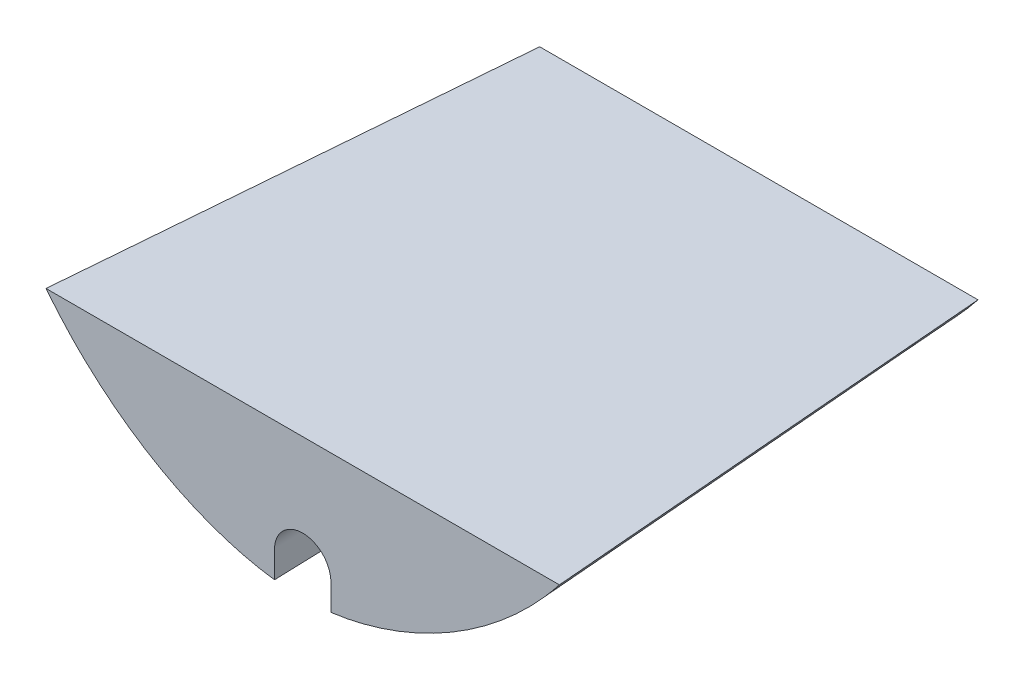
ISO-10303-21;
HEADER;
FILE_DESCRIPTION(('STEP AP214'),'2;1');
FILE_NAME('part.step','',(''),(''),'','','');
FILE_SCHEMA(('AUTOMOTIVE_DESIGN { 1 0 10303 214 1 1 1 1 }'));
ENDSEC;
DATA;
#1=APPLICATION_CONTEXT('core data for automotive mechanical design processes');
#2=APPLICATION_PROTOCOL_DEFINITION('international standard','automotive_design',2000,#1);
#3=PRODUCT_CONTEXT('',#1,'mechanical');
#4=PRODUCT('Part','Part','',(#3));
#5=PRODUCT_RELATED_PRODUCT_CATEGORY('part','',(#4));
#6=PRODUCT_DEFINITION_FORMATION('','',#4);
#7=PRODUCT_DEFINITION_CONTEXT('part definition',#1,'design');
#8=PRODUCT_DEFINITION('design','',#6,#7);
#9=PRODUCT_DEFINITION_SHAPE('','',#8);
#10=(LENGTH_UNIT() NAMED_UNIT(*) SI_UNIT(.MILLI.,.METRE.));
#11=(NAMED_UNIT(*) PLANE_ANGLE_UNIT() SI_UNIT($,.RADIAN.));
#12=(NAMED_UNIT(*) SI_UNIT($,.STERADIAN.) SOLID_ANGLE_UNIT());
#13=UNCERTAINTY_MEASURE_WITH_UNIT(LENGTH_MEASURE(1.E-05),#10,'distance_accuracy_value','');
#14=(GEOMETRIC_REPRESENTATION_CONTEXT(3) GLOBAL_UNCERTAINTY_ASSIGNED_CONTEXT((#13)) GLOBAL_UNIT_ASSIGNED_CONTEXT((#10,
#11,#12)) REPRESENTATION_CONTEXT('',''));
#15=CARTESIAN_POINT('',(0.,0.,0.));
#16=DIRECTION('',(0.,0.,1.));
#17=DIRECTION('',(1.,0.,0.));
#18=AXIS2_PLACEMENT_3D('',#15,#16,#17);
#19=CARTESIAN_POINT('',(10.8242510366134,1.59888132433119,-4.6));
#20=DIRECTION('',(0.,0.,-1.));
#21=DIRECTION('',(-1.,0.,0.));
#22=AXIS2_PLACEMENT_3D('',#19,#20,#21);
#23=PLANE('',#22);
#24=CARTESIAN_POINT('',(-17.8509132975815,7.93340325832024,-4.6));
#25=CARTESIAN_POINT('',(-16.8636910589785,6.67919572075106,-4.6));
#26=CARTESIAN_POINT('',(-15.7861315070657,5.52500217690445,-4.6));
#27=CARTESIAN_POINT('',(-13.4525911327687,3.41414834729763,-4.6));
#28=CARTESIAN_POINT('',(-12.1959805326216,2.45726890498485,-4.6));
#29=CARTESIAN_POINT('',(-9.48808117503049,0.762725286318938,-4.6));
#30=CARTESIAN_POINT('',(-8.07618174998797,0.0493117324777328,-4.6));
#31=CARTESIAN_POINT('',(-5.86418359395584,-0.803333558536333,-4.6));
#32=CARTESIAN_POINT('',(-5.11090132384721,-1.05070674908362,-4.6));
#33=CARTESIAN_POINT('',(-3.95315082351032,-1.35748866215052,-4.6));
#34=CARTESIAN_POINT('',(-3.56298459963794,-1.44861722779861,-4.6));
#35=CARTESIAN_POINT('',(-2.78306292512034,-1.60437880318681,-4.6));
#36=CARTESIAN_POINT('',(-2.39208337089737,-1.66940534865775,-4.6));
#37=CARTESIAN_POINT('',(-2.000000027397,-1.72050420348097,-4.6));
#38=B_SPLINE_CURVE_WITH_KNOTS('',3,(#24,#25,#26,#27,#28,#29,#30,#31,#32,#33,#34,#35,#36,#37),
.UNSPECIFIED.,.F.,.F.,(4,2,2,2,2,2,4),(0.,0.25,0.5,0.75,0.875,0.9375,1.),.UNSPECIFIED.);
#39=CARTESIAN_POINT('',(-16.1200701001956,5.93348227888803,-4.6));
#40=VERTEX_POINT('',#39);
#41=CARTESIAN_POINT('',(-2.000000027397,-1.72050420348097,-4.6));
#42=VERTEX_POINT('',#41);
#43=EDGE_CURVE('E618',#40,#42,#38,.T.);
#44=ORIENTED_EDGE('',*,*,#43,.F.);
#45=DIRECTION('',(-1.,0.,0.));
#46=VECTOR('',#45,1.);
#47=CARTESIAN_POINT('',(16.1201544691477,5.93340325832023,-4.6));
#48=LINE('',#47,#46);
#49=CARTESIAN_POINT('',(16.1201440502173,5.93340325832998,-4.6));
#50=VERTEX_POINT('',#49);
#51=EDGE_CURVE('E622',#50,#40,#48,.T.);
#52=ORIENTED_EDGE('',*,*,#51,.F.);
#53=CARTESIAN_POINT('',(1.99999997260297,-1.72050410459262,-4.6));
#54=CARTESIAN_POINT('',(2.78998663043715,-1.61754783290944,-4.6));
#55=CARTESIAN_POINT('',(3.56593799959461,-1.45973456791565,-4.6));
#56=CARTESIAN_POINT('',(5.09510517037672,-1.05524596285469,-4.6));
#57=CARTESIAN_POINT('',(5.84843313753714,-0.809009022323825,-4.6));
#58=CARTESIAN_POINT('',(6.96314164714682,-0.379918208345076,-4.6));
#59=CARTESIAN_POINT('',(7.33182807924642,-0.226972082921226,-4.6));
#60=CARTESIAN_POINT('',(8.05703867006583,0.0948400896802499,-4.6));
#61=CARTESIAN_POINT('',(8.41449087761085,0.264106207831924,-4.6));
#62=CARTESIAN_POINT('',(9.47204663455084,0.795916516261189,-4.6));
#63=CARTESIAN_POINT('',(10.157429054443,1.18234330174331,-4.6));
#64=CARTESIAN_POINT('',(11.4910730187839,2.01541934691906,-4.6));
#65=CARTESIAN_POINT('',(12.139355511158,2.4620346220722,-4.6));
#66=CARTESIAN_POINT('',(13.3994591363087,3.41441769132813,-4.6));
#67=CARTESIAN_POINT('',(14.0132118715604,3.92211525837391,-4.6));
#68=CARTESIAN_POINT('',(15.7838826954007,5.52131179659364,-4.6));
#69=CARTESIAN_POINT('',(16.8655264593597,6.68152759519312,-4.6));
#70=CARTESIAN_POINT('',(17.8509132975815,7.93340325832024,-4.6));
#71=B_SPLINE_CURVE_WITH_KNOTS('',3,(#53,#54,#55,#56,#57,#58,#59,#60,#61,#62,#63,#64,#65,#66,#67,
#68,#69,#70),.UNSPECIFIED.,.F.,.F.,(4,2,2,2,2,2,2,2,4),(0.,0.125,0.25,0.312499999999999,
0.374999999999999,0.499999999999999,0.624999999999999,0.75,1.),.UNSPECIFIED.);
#72=CARTESIAN_POINT('',(1.99999997260297,-1.72050410459262,-4.6));
#73=VERTEX_POINT('',#72);
#74=EDGE_CURVE('E631',#73,#50,#71,.T.);
#75=ORIENTED_EDGE('',*,*,#74,.F.);
#76=DIRECTION('',(0.,-1.,0.));
#77=VECTOR('',#76,1.);
#78=CARTESIAN_POINT('',(1.999999972603,0.148387096774194,-4.6));
#79=LINE('',#78,#77);
#80=CARTESIAN_POINT('',(1.999999972603,0.148387096774194,-4.6));
#81=VERTEX_POINT('',#80);
#82=EDGE_CURVE('E13',#81,#73,#79,.T.);
#83=ORIENTED_EDGE('',*,*,#82,.F.);
#84=CARTESIAN_POINT('',(-2.73970009005697E-08,0.148387096774194,-4.6));
#85=DIRECTION('',(0.,0.,-1.));
#86=DIRECTION('',(0.,-1.,0.));
#87=AXIS2_PLACEMENT_3D('',#84,#85,#86);
#88=ELLIPSE('',#87,2.00104031216398,2.);
#89=CARTESIAN_POINT('',(-2.000000027397,0.148387096774194,-4.6));
#90=VERTEX_POINT('',#89);
#91=EDGE_CURVE('E267',#90,#81,#88,.T.);
#92=ORIENTED_EDGE('',*,*,#91,.F.);
#93=DIRECTION('',(0.,1.,0.));
#94=VECTOR('',#93,1.);
#95=CARTESIAN_POINT('',(-2.000000027397,-1.72050420348097,-4.6));
#96=LINE('',#95,#94);
#97=EDGE_CURVE('E624',#42,#90,#96,.T.);
#98=ORIENTED_EDGE('',*,*,#97,.F.);
#99=EDGE_LOOP('',(#44,#52,#75,#83,#92,#98));
#100=FACE_BOUND('',#99,.T.);
#101=ADVANCED_FACE('F256',(#100),#23,.T.);
#102=CARTESIAN_POINT('',(11.0381559178381,1.47426420032803,0.));
#103=DIRECTION('',(0.,0.,-1.));
#104=DIRECTION('',(-1.,0.,0.));
#105=AXIS2_PLACEMENT_3D('',#102,#103,#104);
#106=PLANE('',#105);
#107=CARTESIAN_POINT('',(2.,-1.87372147023052,0.));
#108=CARTESIAN_POINT('',(2.8085833387686,-1.77210646298922,0.));
#109=CARTESIAN_POINT('',(3.60279633318172,-1.6148458342032,0.));
#110=CARTESIAN_POINT('',(5.16785892613522,-1.20985557654462,0.));
#111=CARTESIAN_POINT('',(5.93881420733136,-0.962535177744804,0.));
#112=CARTESIAN_POINT('',(7.07949136501593,-0.530544260995766,0.));
#113=CARTESIAN_POINT('',(7.45759581472359,-0.376080268648637,0.));
#114=CARTESIAN_POINT('',(8.20139092441132,-0.0506455185253097,0.));
#115=CARTESIAN_POINT('',(8.56795255564779,0.12067510093443,0.));
#116=CARTESIAN_POINT('',(9.65230774127768,0.659353434821817,0.));
#117=CARTESIAN_POINT('',(10.3548499045597,1.05130135233232,0.));
#118=CARTESIAN_POINT('',(11.7214619311164,1.89722704832373,0.));
#119=CARTESIAN_POINT('',(12.3855561391291,2.35116557516864,0.));
#120=CARTESIAN_POINT('',(13.6759303634494,3.32001140519149,0.));
#121=CARTESIAN_POINT('',(14.3038410886317,3.8365445732468,0.));
#122=CARTESIAN_POINT('',(16.1182653676208,5.4682132879064,0.));
#123=CARTESIAN_POINT('',(17.2252655144087,6.65335319640276,0.));
#124=CARTESIAN_POINT('',(18.2322325114427,7.93340325832024,0.));
#125=B_SPLINE_CURVE_WITH_KNOTS('',3,(#107,#108,#109,#110,#111,#112,#113,#114,#115,#116,#117,
#118,#119,#120,#121,#122,#123,#124),.UNSPECIFIED.,.F.,.F.,(4,2,2,2,2,2,2,2,4),(0.,0.125,0.25,
0.3125,0.375,0.5,0.625,0.75,1.),.UNSPECIFIED.);
#126=CARTESIAN_POINT('',(2.,-1.87372147023052,0.));
#127=VERTEX_POINT('',#126);
#128=CARTESIAN_POINT('',(18.2322325114427,7.93340325832024,0.));
#129=VERTEX_POINT('',#128);
#130=EDGE_CURVE('E825',#127,#129,#125,.T.);
#131=ORIENTED_EDGE('',*,*,#130,.T.);
#132=DIRECTION('',(-1.,0.,0.));
#133=VECTOR('',#132,1.);
#134=CARTESIAN_POINT('',(18.2322325114427,7.93340325832024,0.));
#135=LINE('',#134,#133);
#136=CARTESIAN_POINT('',(-18.232232571571,7.93340325832022,0.));
#137=VERTEX_POINT('',#136);
#138=EDGE_CURVE('E698',#129,#137,#135,.T.);
#139=ORIENTED_EDGE('',*,*,#138,.T.);
#140=CARTESIAN_POINT('',(-18.232232571571,7.93340325832022,0.));
#141=CARTESIAN_POINT('',(-17.2233232333737,6.65088420652353,0.));
#142=CARTESIAN_POINT('',(-16.1206355437829,5.47211905546335,0.));
#143=CARTESIAN_POINT('',(-14.3279587145357,3.8573648354428,0.));
#144=CARTESIAN_POINT('',(-13.7070933671581,3.34489902130568,0.));
#145=CARTESIAN_POINT('',(-12.4170637726961,2.37340402495546,0.));
#146=CARTESIAN_POINT('',(-11.7466941908923,1.9135014389482,0.));
#147=CARTESIAN_POINT('',(-9.66666365736906,0.624028853571639,0.));
#148=CARTESIAN_POINT('',(-8.22042480501936,-0.0976140881219674,0.));
#149=CARTESIAN_POINT('',(-5.95476540202523,-0.956910213830559,0.));
#150=CARTESIAN_POINT('',(-5.18324180286465,-1.20555982354665,0.));
#151=CARTESIAN_POINT('',(-3.99760642594856,-1.51283598074379,0.));
#152=CARTESIAN_POINT('',(-3.59857545562637,-1.60377415513956,0.));
#153=CARTESIAN_POINT('',(-2.80082321260629,-1.75884043140487,0.));
#154=CARTESIAN_POINT('',(-2.40095058348368,-1.82333371794088,0.));
#155=CARTESIAN_POINT('',(-2.00000000000006,-1.87372137726835,0.));
#156=B_SPLINE_CURVE_WITH_KNOTS('',3,(#140,#141,#142,#143,#144,#145,#146,#147,#148,#149,#150,
#151,#152,#153,#154,#155),.UNSPECIFIED.,.F.,.F.,(4,2,2,2,2,2,2,4),(0.,0.25,0.375,0.5,0.75,0.875,
0.9375,1.),.UNSPECIFIED.);
#157=CARTESIAN_POINT('',(-2.,-1.87372137726835,0.));
#158=VERTEX_POINT('',#157);
#159=EDGE_CURVE('E829',#137,#158,#156,.T.);
#160=ORIENTED_EDGE('',*,*,#159,.T.);
#161=DIRECTION('',(0.,1.,0.));
#162=VECTOR('',#161,1.);
#163=CARTESIAN_POINT('',(-2.,-1.87372137726836,0.));
#164=LINE('',#163,#162);
#165=CARTESIAN_POINT('',(-2.,0.,0.));
#166=VERTEX_POINT('',#165);
#167=EDGE_CURVE('E855',#158,#166,#164,.T.);
#168=ORIENTED_EDGE('',*,*,#167,.T.);
#169=CARTESIAN_POINT('',(0.,0.,0.));
#170=DIRECTION('',(0.,0.,-1.));
#171=DIRECTION('',(0.,-1.,0.));
#172=AXIS2_PLACEMENT_3D('',#169,#170,#171);
#173=ELLIPSE('',#172,2.00104031216398,2.);
#174=CARTESIAN_POINT('',(2.,0.,0.));
#175=VERTEX_POINT('',#174);
#176=EDGE_CURVE('E845',#166,#175,#173,.T.);
#177=ORIENTED_EDGE('',*,*,#176,.T.);
#178=DIRECTION('',(0.,-1.,0.));
#179=VECTOR('',#178,1.);
#180=CARTESIAN_POINT('',(2.,0.,0.));
#181=LINE('',#180,#179);
#182=EDGE_CURVE('E693',#175,#127,#181,.T.);
#183=ORIENTED_EDGE('',*,*,#182,.T.);
#184=EDGE_LOOP('',(#131,#139,#160,#168,#177,#183));
#185=FACE_BOUND('',#184,.T.);
#186=ADVANCED_FACE('F608',(#185),#106,.F.);
#187=CARTESIAN_POINT('',(-18.232232571571,7.93340325832022,0.));
#188=DIRECTION('',(0.,1.,0.));
#189=DIRECTION('',(1.,0.,0.));
#190=AXIS2_PLACEMENT_3D('',#187,#188,#189);
#191=PLANE('',#190);
#192=ORIENTED_EDGE('',*,*,#138,.F.);
#193=DIRECTION('',(-0.0826121259667153,0.,-0.996581776194638));
#194=VECTOR('',#193,1.);
#195=CARTESIAN_POINT('',(18.0415729045121,7.93340325832024,-2.3));
#196=LINE('',#195,#194);
#197=CARTESIAN_POINT('',(17.8509132975815,7.93340325832024,-4.6));
#198=VERTEX_POINT('',#197);
#199=EDGE_CURVE('E692',#129,#198,#196,.T.);
#200=ORIENTED_EDGE('',*,*,#199,.T.);
#201=CARTESIAN_POINT('',(15.9421442288927,7.93340325832024,-27.8));
#202=CARTESIAN_POINT('',(16.5784005851223,7.93340325832024,-20.0666666666667));
#203=CARTESIAN_POINT('',(17.2146569413519,7.93340325832024,-12.3333333333333));
#204=CARTESIAN_POINT('',(17.8509132975815,7.93340325832024,-4.6));
#205=B_SPLINE_CURVE_WITH_KNOTS('',3,(#201,#202,#203,#204),.UNSPECIFIED.,.F.,.F.,(4,4),(0.,1.),.UNSPECIFIED.);
#206=CARTESIAN_POINT('',(15.9421442288927,7.93340325832024,-27.8));
#207=VERTEX_POINT('',#206);
#208=EDGE_CURVE('E516',#207,#198,#205,.T.);
#209=ORIENTED_EDGE('',*,*,#208,.F.);
#210=DIRECTION('',(0.0813004124382634,0.,0.996689642234416));
#211=VECTOR('',#210,1.);
#212=CARTESIAN_POINT('',(15.7545322174055,7.93340325832024,-30.1));
#213=LINE('',#212,#211);
#214=CARTESIAN_POINT('',(15.5669202059184,7.93340325832024,-32.4));
#215=VERTEX_POINT('',#214);
#216=EDGE_CURVE('E377',#215,#207,#213,.T.);
#217=ORIENTED_EDGE('',*,*,#216,.F.);
#218=DIRECTION('',(-1.,0.,0.));
#219=VECTOR('',#218,1.);
#220=CARTESIAN_POINT('',(15.5669202059184,7.93340325832024,-32.4));
#221=LINE('',#220,#219);
#222=CARTESIAN_POINT('',(-15.5669202031086,7.93340325832024,-32.4));
#223=VERTEX_POINT('',#222);
#224=EDGE_CURVE('E507',#215,#223,#221,.T.);
#225=ORIENTED_EDGE('',*,*,#224,.T.);
#226=DIRECTION('',(0.0813004160057,0.,-0.996689641943419));
#227=VECTOR('',#226,1.);
#228=CARTESIAN_POINT('',(-15.7545322228829,7.93340325832024,-30.1));
#229=LINE('',#228,#227);
#230=CARTESIAN_POINT('',(-15.9421442426572,7.93340325832024,-27.8));
#231=VERTEX_POINT('',#230);
#232=EDGE_CURVE('E452',#231,#223,#229,.T.);
#233=ORIENTED_EDGE('',*,*,#232,.F.);
#234=CARTESIAN_POINT('',(-17.8509132975815,7.93340325832024,-4.6));
#235=CARTESIAN_POINT('',(-17.2146569459401,7.93340325832024,-12.3333333333333));
#236=CARTESIAN_POINT('',(-16.5784005942986,7.93340325832024,-20.0666666666667));
#237=CARTESIAN_POINT('',(-15.9421442426572,7.93340325832024,-27.8));
#238=B_SPLINE_CURVE_WITH_KNOTS('',3,(#234,#235,#236,#237),.UNSPECIFIED.,.F.,.F.,(4,4),(0.,1.),.UNSPECIFIED.);
#239=CARTESIAN_POINT('',(-17.8509132975815,7.93340325832024,-4.6));
#240=VERTEX_POINT('',#239);
#241=EDGE_CURVE('E795',#240,#231,#238,.T.);
#242=ORIENTED_EDGE('',*,*,#241,.F.);
#243=DIRECTION('',(-0.082612138904504,0.,0.996581775122154));
#244=VECTOR('',#243,1.);
#245=CARTESIAN_POINT('',(-18.0415729345762,7.93340325832023,-2.3));
#246=LINE('',#245,#244);
#247=EDGE_CURVE('E639',#240,#137,#246,.T.);
#248=ORIENTED_EDGE('',*,*,#247,.T.);
#249=EDGE_LOOP('',(#192,#200,#209,#217,#225,#233,#242,#248));
#250=FACE_BOUND('',#249,.T.);
#251=ADVANCED_FACE('F512',(#250),#191,.T.);
#252=CARTESIAN_POINT('',(18.2322325114427,7.93340325832024,0.));
#253=CARTESIAN_POINT('',(17.8509132975815,7.93340325832024,-4.6));
#254=CARTESIAN_POINT('',(17.2252655144087,6.65335319640276,0.));
#255=CARTESIAN_POINT('',(16.8655264593597,6.68152759519312,-4.6));
#256=CARTESIAN_POINT('',(16.1182653676208,5.4682132879064,0.));
#257=CARTESIAN_POINT('',(15.7838826954007,5.52131179659364,-4.6));
#258=CARTESIAN_POINT('',(14.3038410886317,3.8365445732468,0.));
#259=CARTESIAN_POINT('',(14.0132118715604,3.92211525837391,-4.6));
#260=CARTESIAN_POINT('',(13.6759303634494,3.32001140519149,0.));
#261=CARTESIAN_POINT('',(13.3994591363087,3.41441769132813,-4.6));
#262=CARTESIAN_POINT('',(12.3855561391291,2.35116557516864,0.));
#263=CARTESIAN_POINT('',(12.139355511158,2.4620346220722,-4.6));
#264=CARTESIAN_POINT('',(11.7214619311164,1.89722704832373,0.));
#265=CARTESIAN_POINT('',(11.4910730187839,2.01541934691906,-4.6));
#266=CARTESIAN_POINT('',(10.3548499045597,1.05130135233232,0.));
#267=CARTESIAN_POINT('',(10.157429054443,1.18234330174331,-4.6));
#268=CARTESIAN_POINT('',(9.65230774127768,0.659353434821817,0.));
#269=CARTESIAN_POINT('',(9.47204663455084,0.795916516261189,-4.6));
#270=CARTESIAN_POINT('',(8.56795255564779,0.12067510093443,0.));
#271=CARTESIAN_POINT('',(8.41449087761085,0.264106207831924,-4.6));
#272=CARTESIAN_POINT('',(8.20139092441132,-0.0506455185253097,0.));
#273=CARTESIAN_POINT('',(8.05703867006583,0.0948400896802499,-4.6));
#274=CARTESIAN_POINT('',(7.45759581472359,-0.376080268648637,0.));
#275=CARTESIAN_POINT('',(7.33182807924642,-0.226972082921226,-4.6));
#276=CARTESIAN_POINT('',(7.07949136501593,-0.530544260995766,0.));
#277=CARTESIAN_POINT('',(6.96314164714682,-0.379918208345076,-4.6));
#278=CARTESIAN_POINT('',(5.93881420733136,-0.962535177744804,0.));
#279=CARTESIAN_POINT('',(5.84843313753714,-0.809009022323825,-4.6));
#280=CARTESIAN_POINT('',(5.16785892613522,-1.20985557654462,0.));
#281=CARTESIAN_POINT('',(5.09510517037672,-1.05524596285469,-4.6));
#282=CARTESIAN_POINT('',(3.60279633318172,-1.6148458342032,0.));
#283=CARTESIAN_POINT('',(3.56593799959461,-1.45973456791565,-4.6));
#284=CARTESIAN_POINT('',(2.8085833387686,-1.77210646298922,0.));
#285=CARTESIAN_POINT('',(2.78998663043715,-1.61754783290944,-4.6));
#286=CARTESIAN_POINT('',(2.,-1.87372147023052,0.));
#287=CARTESIAN_POINT('',(1.99999997260297,-1.72050410459262,-4.6));
#288=B_SPLINE_SURFACE_WITH_KNOTS('',3,1,((#252,#253),(#254,#255),(#256,#257),(#258,#259),(#260,
#261),(#262,#263),(#264,#265),(#266,#267),(#268,#269),(#270,#271),(#272,#273),(#274,#275),(#276,
#277),(#278,#279),(#280,#281),(#282,#283),(#284,#285),(#286,#287)),.UNSPECIFIED.,.F.,.F.,.F.,(4,
2,2,2,2,2,2,2,4),(2,2),(0.,0.25,0.375,0.5,0.625,0.6875,0.75,0.875,1.),(0.,1.),.UNSPECIFIED.);
#289=DIRECTION('',(-5.95257538409167E-09,0.0332896617913837,-0.999445745609943));
#290=VECTOR('',#289,1.);
#291=CARTESIAN_POINT('',(1.99999998630149,-1.79711278741157,-2.3));
#292=LINE('',#291,#290);
#293=EDGE_CURVE('E284',#127,#73,#292,.T.);
#294=CARTESIAN_POINT('',(17.8509132975815,7.93340325832024,-4.6));
#295=CARTESIAN_POINT('',(16.8655264593597,6.68152759519312,-4.6));
#296=CARTESIAN_POINT('',(15.7838826954007,5.52131179659364,-4.6));
#297=CARTESIAN_POINT('',(14.0132118715604,3.92211525837391,-4.6));
#298=CARTESIAN_POINT('',(13.3994591363087,3.41441769132813,-4.6));
#299=CARTESIAN_POINT('',(12.139355511158,2.4620346220722,-4.6));
#300=CARTESIAN_POINT('',(11.4910730187839,2.01541934691906,-4.6));
#301=CARTESIAN_POINT('',(10.157429054443,1.18234330174331,-4.6));
#302=CARTESIAN_POINT('',(9.47204663455084,0.795916516261189,-4.6));
#303=CARTESIAN_POINT('',(8.41449087761085,0.264106207831924,-4.6));
#304=CARTESIAN_POINT('',(8.05703867006583,0.0948400896802499,-4.6));
#305=CARTESIAN_POINT('',(7.33182807924642,-0.226972082921226,-4.6));
#306=CARTESIAN_POINT('',(6.96314164714682,-0.379918208345076,-4.6));
#307=CARTESIAN_POINT('',(5.84843313753714,-0.809009022323825,-4.6));
#308=CARTESIAN_POINT('',(5.09510517037672,-1.05524596285469,-4.6));
#309=CARTESIAN_POINT('',(3.56593799959461,-1.45973456791565,-4.6));
#310=CARTESIAN_POINT('',(2.78998663043715,-1.61754783290944,-4.6));
#311=CARTESIAN_POINT('',(1.99999997260297,-1.72050410459262,-4.6));
#312=B_SPLINE_CURVE_WITH_KNOTS('',3,(#294,#295,#296,#297,#298,#299,#300,#301,#302,#303,#304,
#305,#306,#307,#308,#309,#310,#311),.UNSPECIFIED.,.F.,.F.,(4,2,2,2,2,2,2,2,4),(0.,0.25,
0.375000000000001,0.500000000000001,0.625000000000001,0.687500000000001,0.75,0.875,1.),.UNSPECIFIED.);
#313=EDGE_CURVE('E592',#198,#50,#312,.T.);
#314=ORIENTED_EDGE('',*,*,#130,.F.);
#315=ORIENTED_EDGE('',*,*,#293,.T.);
#316=ORIENTED_EDGE('',*,*,#74,.T.);
#317=ORIENTED_EDGE('',*,*,#313,.F.);
#318=ORIENTED_EDGE('',*,*,#199,.F.);
#319=EDGE_LOOP('',(#314,#315,#316,#317,#318));
#320=FACE_BOUND('',#319,.T.);
#321=ADVANCED_FACE('F667',(#320),#288,.T.);
#322=CARTESIAN_POINT('',(-2.00000000000006,-1.87372137726835,0.));
#323=CARTESIAN_POINT('',(-2.000000027397,-1.72050420348097,-4.6));
#324=CARTESIAN_POINT('',(-3.60380233393452,-1.67217073995845,0.));
#325=CARTESIAN_POINT('',(-3.56833340139848,-1.51610878418808,-4.6));
#326=CARTESIAN_POINT('',(-6.77613874196916,-0.820507343307926,0.));
#327=CARTESIAN_POINT('',(-6.66626444551495,-0.665247959915445,-4.6));
#328=CARTESIAN_POINT('',(-11.1274778941116,1.35481997848134,0.));
#329=CARTESIAN_POINT('',(-10.9149228600056,1.48568424368955,-4.6));
#330=CARTESIAN_POINT('',(-14.3808731146273,3.80980442215772,0.));
#331=CARTESIAN_POINT('',(-14.0869449075915,3.89583625100355,-4.6));
#332=CARTESIAN_POINT('',(-16.6694601565461,6.0602650188913,0.));
#333=CARTESIAN_POINT('',(-16.3225005043497,6.10094603686668,-4.6));
#334=CARTESIAN_POINT('',(-17.7277779024724,7.29214373242187,0.));
#335=CARTESIAN_POINT('',(-17.35730217828,7.30629948953565,-4.6));
#336=CARTESIAN_POINT('',(-18.232232571571,7.93340325832022,0.));
#337=CARTESIAN_POINT('',(-17.8509132975815,7.93340325832024,-4.6));
#338=B_SPLINE_SURFACE_WITH_KNOTS('',3,1,((#322,#323),(#324,#325),(#326,#327),(#328,#329),(#330,
#331),(#332,#333),(#334,#335),(#336,#337)),.UNSPECIFIED.,.F.,.F.,.F.,(4,1,1,1,1,4),(2,2),(0.,
0.25,0.5,0.75,0.875,1.),(0.,1.),.UNSPECIFIED.);
#339=EDGE_CURVE('E630',#240,#40,#38,.T.);
#340=DIRECTION('',(-5.95256860806555E-09,0.0332896201540579,-0.999445746996804));
#341=VECTOR('',#340,1.);
#342=CARTESIAN_POINT('',(-2.0000000136985,-1.79711279037466,-2.3));
#343=LINE('',#342,#341);
#344=EDGE_CURVE('E739',#158,#42,#343,.T.);
#345=ORIENTED_EDGE('',*,*,#159,.F.);
#346=ORIENTED_EDGE('',*,*,#247,.F.);
#347=ORIENTED_EDGE('',*,*,#339,.T.);
#348=ORIENTED_EDGE('',*,*,#43,.T.);
#349=ORIENTED_EDGE('',*,*,#344,.F.);
#350=EDGE_LOOP('',(#345,#346,#347,#348,#349));
#351=FACE_BOUND('',#350,.T.);
#352=ADVANCED_FACE('F637',(#351),#338,.T.);
#353=CARTESIAN_POINT('',(2.,-1.87372147023052,0.));
#354=CARTESIAN_POINT('',(1.99999997260297,-1.72050410459262,-4.6));
#355=CARTESIAN_POINT('',(2.,-1.7175780184133,0.));
#356=CARTESIAN_POINT('',(1.99999997260297,-1.56476316718651,-4.6));
#357=CARTESIAN_POINT('',(2.,-1.40521272940061,0.));
#358=CARTESIAN_POINT('',(1.99999997260298,-1.25335800199463,-4.6));
#359=CARTESIAN_POINT('',(2.,-0.936605971266648,0.));
#360=CARTESIAN_POINT('',(1.99999997260298,-0.786307761169054,-4.6));
#361=CARTESIAN_POINT('',(2.,-0.468116964571494,0.));
#362=CARTESIAN_POINT('',(1.999999972603,-0.319142639656667,-4.6));
#363=CARTESIAN_POINT('',(2.,-0.155986889553437,0.));
#364=CARTESIAN_POINT('',(1.999999972603,-0.00750743706746337,-4.6));
#365=CARTESIAN_POINT('',(2.,0.261945765500162,0.));
#366=CARTESIAN_POINT('',(1.999999972603,0.410177771114518,-4.6));
#367=CARTESIAN_POINT('',(1.89599274187829,0.785651410335236,0.));
#368=CARTESIAN_POINT('',(1.89611254293045,0.933697265317321,-4.6));
#369=CARTESIAN_POINT('',(1.45110452642855,1.45181829945247,0.));
#370=CARTESIAN_POINT('',(1.45138720317617,1.5999371535605,-4.6));
#371=CARTESIAN_POINT('',(0.785395864534584,1.89687696480496,0.));
#372=CARTESIAN_POINT('',(0.785627711940925,2.04519767734516,-4.6));
#373=CARTESIAN_POINT('',(-9.7766495420204E-09,2.05322947009373,0.));
#374=CARTESIAN_POINT('',(-1.77908448606781E-08,2.20165028211645,-4.6));
#375=CARTESIAN_POINT('',(-0.785395881368999,1.89687695748641,0.));
#376=CARTESIAN_POINT('',(-0.785627750196885,2.04519768453777,-4.6));
#377=CARTESIAN_POINT('',(-1.45110453643116,1.45181828856078,0.));
#378=CARTESIAN_POINT('',(-1.45138724814882,1.59993716426023,-4.6));
#379=CARTESIAN_POINT('',(-1.89599274436725,0.785651401847378,0.));
#380=CARTESIAN_POINT('',(-1.89611259528359,0.933697273649287,-4.6));
#381=CARTESIAN_POINT('',(-2.,0.261945762390686,0.));
#382=CARTESIAN_POINT('',(-2.000000027397,0.410177774165088,-4.6));
#383=CARTESIAN_POINT('',(-2.,-0.155986888025226,0.));
#384=CARTESIAN_POINT('',(-2.000000027397,-0.00750743920732479,-4.6));
#385=CARTESIAN_POINT('',(-2.,-0.468116949763524,0.));
#386=CARTESIAN_POINT('',(-2.000000027397,-0.319142656165502,-4.6));
#387=CARTESIAN_POINT('',(-2.,-0.936605921803893,0.));
#388=CARTESIAN_POINT('',(-2.000000027397,-0.78630781359247,-4.6));
#389=CARTESIAN_POINT('',(-2.,-1.40521264664584,0.));
#390=CARTESIAN_POINT('',(-2.000000027397,-1.25335808894483,-4.6));
#391=CARTESIAN_POINT('',(-2.,-1.71757792512734,0.));
#392=CARTESIAN_POINT('',(-2.000000027397,-1.56476326575191,-4.6));
#393=CARTESIAN_POINT('',(-2.,-1.87372137726835,0.));
#394=CARTESIAN_POINT('',(-2.000000027397,-1.72050420348097,-4.6));
#395=B_SPLINE_SURFACE_WITH_KNOTS('',3,1,((#353,#354),(#355,#356),(#357,#358),(#359,#360),(#361,
#362),(#363,#364),(#365,#366),(#367,#368),(#369,#370),(#371,#372),(#373,#374),(#375,#376),(#377,
#378),(#379,#380),(#381,#382),(#383,#384),(#385,#386),(#387,#388),(#389,#390),(#391,#392),(#393,
#394)),.UNSPECIFIED.,.F.,.F.,.F.,(4,1,1,1,2,1,1,1,1,1,1,1,2,1,1,1,4),(2,2),(0.,
0.0466557868263615,0.093311573652723,0.139967360479084,0.186623147305446,0.264967360430711,
0.343311573555976,0.421655786681241,0.499999999806506,0.578344212931772,0.656688426057036,
0.735032639182302,0.813376852307567,0.860032639230675,0.906688426153783,0.953344213076892,1.),
(0.,1.),.UNSPECIFIED.);
#396=ORIENTED_EDGE('',*,*,#182,.F.);
#397=ORIENTED_EDGE('',*,*,#176,.F.);
#398=ORIENTED_EDGE('',*,*,#167,.F.);
#399=ORIENTED_EDGE('',*,*,#344,.T.);
#400=ORIENTED_EDGE('',*,*,#97,.T.);
#401=ORIENTED_EDGE('',*,*,#91,.T.);
#402=ORIENTED_EDGE('',*,*,#82,.T.);
#403=ORIENTED_EDGE('',*,*,#293,.F.);
#404=EDGE_LOOP('',(#396,#397,#398,#399,#400,#401,#402,#403));
#405=FACE_BOUND('',#404,.T.);
#406=ADVANCED_FACE('F666',(#405),#395,.T.);
#407=CARTESIAN_POINT('',(17.8509132975815,7.93340325832024,-4.6));
#408=CARTESIAN_POINT('',(17.2146569413519,7.93340325832024,-12.3333333333333));
#409=CARTESIAN_POINT('',(16.5784005851223,7.93340325832024,-20.0666666666667));
#410=CARTESIAN_POINT('',(15.9421442288927,7.93340325832024,-27.8));
#411=CARTESIAN_POINT('',(17.3038115108649,7.23834281558102,-4.6));
#412=CARTESIAN_POINT('',(16.6670144531436,7.23779600269615,-12.3333333333333));
#413=CARTESIAN_POINT('',(16.0302173954223,7.23724918981129,-20.0666666666667));
#414=CARTESIAN_POINT('',(15.3934203377009,7.23670237692642,-27.8));
#415=CARTESIAN_POINT('',(16.7270371831233,6.57153780557786,-4.6));
#416=CARTESIAN_POINT('',(16.0893916527124,6.57097297587001,-12.3333333333333));
#417=CARTESIAN_POINT('',(15.4517461223014,6.57040814616215,-20.0666666666667));
#418=CARTESIAN_POINT('',(14.8141005918905,6.56984331645429,-27.8));
#419=CARTESIAN_POINT('',(16.1201544691477,5.93340325832022,-4.6));
#420=CARTESIAN_POINT('',(15.4813007214343,5.93340325832023,-12.3333333333333));
#421=CARTESIAN_POINT('',(14.8424469737208,5.93340325832023,-20.0666666666667));
#422=CARTESIAN_POINT('',(14.2035932260074,5.93340325832023,-27.8));
#423=B_SPLINE_SURFACE_WITH_KNOTS('',3,3,((#407,#408,#409,#410),(#411,#412,#413,#414),(#415,#416,
#417,#418),(#419,#420,#421,#422)),.UNSPECIFIED.,.F.,.F.,.F.,(4,4),(4,4),(0.,1.),(0.,1.),.UNSPECIFIED.);
#424=CARTESIAN_POINT('',(16.1201544691477,5.93340325832022,-4.6));
#425=CARTESIAN_POINT('',(15.4813007214343,5.93340325832023,-12.3333333333333));
#426=CARTESIAN_POINT('',(14.8424469737208,5.93340325832023,-20.0666666666667));
#427=CARTESIAN_POINT('',(14.2035932260074,5.93340325832023,-27.8));
#428=B_SPLINE_CURVE_WITH_KNOTS('',3,(#424,#425,#426,#427),.UNSPECIFIED.,.F.,.F.,(4,4),(0.,1.),.UNSPECIFIED.);
#429=CARTESIAN_POINT('',(14.2035932260074,5.93340325832023,-27.8));
#430=VERTEX_POINT('',#429);
#431=EDGE_CURVE('E275',#50,#430,#428,.T.);
#432=CARTESIAN_POINT('',(1.99999999999998,-0.944180279199554,-27.8));
#433=CARTESIAN_POINT('',(2.69681825141938,-0.834692979070072,-27.8));
#434=CARTESIAN_POINT('',(3.38177166669486,-0.674733392587507,-27.8));
#435=CARTESIAN_POINT('',(4.73267466466142,-0.273973079602969,-27.8));
#436=CARTESIAN_POINT('',(5.40214369278552,-0.0321790847293783,-27.8));
#437=CARTESIAN_POINT('',(7.35476450210714,0.787083696161777,-27.8));
#438=CARTESIAN_POINT('',(8.58531882935578,1.453950973454,-27.8));
#439=CARTESIAN_POINT('',(10.3411381566103,2.60684799609818,-27.8));
#440=CARTESIAN_POINT('',(10.9111670627969,3.01699024436586,-27.8));
#441=CARTESIAN_POINT('',(12.0213772122474,3.88787498172664,-27.8));
#442=CARTESIAN_POINT('',(12.5608492326086,4.34851799129057,-27.8));
#443=CARTESIAN_POINT('',(14.1122823341292,5.78511206108639,-27.8));
#444=CARTESIAN_POINT('',(15.0661967920912,6.82123489628873,-27.8));
#445=CARTESIAN_POINT('',(15.9421442288927,7.93340325832024,-27.8));
#446=B_SPLINE_CURVE_WITH_KNOTS('',3,(#432,#433,#434,#435,#436,#437,#438,#439,#440,#441,#442,
#443,#444,#445),.UNSPECIFIED.,.F.,.F.,(4,2,2,2,2,2,4),(0.,0.125,0.25,0.5,0.625,0.75,1.),.UNSPECIFIED.);
#447=EDGE_CURVE('E797',#430,#207,#446,.T.);
#448=ORIENTED_EDGE('',*,*,#313,.T.);
#449=ORIENTED_EDGE('',*,*,#431,.T.);
#450=ORIENTED_EDGE('',*,*,#447,.T.);
#451=ORIENTED_EDGE('',*,*,#208,.T.);
#452=EDGE_LOOP('',(#448,#449,#450,#451));
#453=FACE_BOUND('',#452,.T.);
#454=ADVANCED_FACE('F969',(#453),#423,.T.);
#455=CARTESIAN_POINT('',(8.46587418579307E-12,5.93340325828865,1.10658295602816E-11));
#456=DIRECTION('',(-1.42681591276755E-12,-1.,-1.86500547469502E-12));
#457=DIRECTION('',(0.,1.86500547469502E-12,-1.));
#458=AXIS2_PLACEMENT_3D('',#455,#456,#457);
#459=PLANE('',#458);
#460=CARTESIAN_POINT('',(-14.2035850606299,5.93340325836129,-27.8));
#461=CARTESIAN_POINT('',(-14.8424383863651,5.93340325834771,-20.0666666666667));
#462=CARTESIAN_POINT('',(-15.4812917121002,5.93340325833413,-12.3333333333333));
#463=CARTESIAN_POINT('',(-16.1201450378354,5.93340325832056,-4.6));
#464=B_SPLINE_CURVE_WITH_KNOTS('',3,(#460,#461,#462,#463),.UNSPECIFIED.,.F.,.F.,(4,4),(0.,1.),.UNSPECIFIED.);
#465=CARTESIAN_POINT('',(-14.2035764484809,5.93340326378152,-27.8));
#466=VERTEX_POINT('',#465);
#467=EDGE_CURVE('E793',#466,#40,#464,.T.);
#468=ORIENTED_EDGE('',*,*,#467,.F.);
#469=DIRECTION('',(1.,-1.42681591276755E-12,0.));
#470=VECTOR('',#469,1.);
#471=CARTESIAN_POINT('',(-14.2035850606294,5.93340325836076,-27.8));
#472=LINE('',#471,#470);
#473=EDGE_CURVE('E740',#466,#430,#472,.T.);
#474=ORIENTED_EDGE('',*,*,#473,.T.);
#475=ORIENTED_EDGE('',*,*,#431,.F.);
#476=ORIENTED_EDGE('',*,*,#51,.T.);
#477=EDGE_LOOP('',(#468,#474,#475,#476));
#478=FACE_BOUND('',#477,.T.);
#479=ADVANCED_FACE('F954',(#478),#459,.T.);
#480=CARTESIAN_POINT('',(-16.1201450378354,5.93340325832056,-4.6));
#481=CARTESIAN_POINT('',(-15.4812917121002,5.93340325833413,-12.3333333333333));
#482=CARTESIAN_POINT('',(-14.8424383863651,5.93340325834771,-20.0666666666667));
#483=CARTESIAN_POINT('',(-14.2035850606299,5.93340325836129,-27.8));
#484=CARTESIAN_POINT('',(-16.7248803653356,6.56927814554758,-4.6));
#485=CARTESIAN_POINT('',(-16.0873122509238,6.56880080443911,-12.3333333333333));
#486=CARTESIAN_POINT('',(-15.449744136512,6.56832346333065,-20.0666666666667));
#487=CARTESIAN_POINT('',(-14.8121760221002,6.56784612222219,-27.8));
#488=CARTESIAN_POINT('',(-17.3018677225214,7.23587328808392,-4.6));
#489=CARTESIAN_POINT('',(-16.6651437334003,7.23541978623585,-12.3333333333333));
#490=CARTESIAN_POINT('',(-16.0284197442793,7.23496628438779,-20.0666666666667));
#491=CARTESIAN_POINT('',(-15.3916957551582,7.23451278253973,-27.8));
#492=CARTESIAN_POINT('',(-17.8509132975815,7.93340325832024,-4.6));
#493=CARTESIAN_POINT('',(-17.2146569459401,7.93340325832024,-12.3333333333333));
#494=CARTESIAN_POINT('',(-16.5784005942986,7.93340325832024,-20.0666666666667));
#495=CARTESIAN_POINT('',(-15.9421442426572,7.93340325832024,-27.8));
#496=B_SPLINE_SURFACE_WITH_KNOTS('',3,3,((#480,#481,#482,#483),(#484,#485,#486,#487),(#488,#489,
#490,#491),(#492,#493,#494,#495)),.UNSPECIFIED.,.F.,.F.,.F.,(4,4),(4,4),(0.,1.),(0.,1.),.UNSPECIFIED.);
#497=CARTESIAN_POINT('',(-15.9421442426572,7.93340325832024,-27.8));
#498=CARTESIAN_POINT('',(-15.0648397688141,6.819512031342,-27.8));
#499=CARTESIAN_POINT('',(-14.1136886171562,5.78747562938748,-27.8));
#500=CARTESIAN_POINT('',(-12.063693097051,3.88711232162924,-27.8));
#501=CARTESIAN_POINT('',(-10.9648640077886,3.01876847972166,-27.8));
#502=CARTESIAN_POINT('',(-9.19382648679721,1.85236272803202,-27.8));
#503=CARTESIAN_POINT('',(-8.58324112580122,1.48719919821334,-27.8));
#504=CARTESIAN_POINT('',(-7.34113137364606,0.81973691365802,-27.8));
#505=CARTESIAN_POINT('',(-6.70696832000041,0.515509750833748,-27.8));
#506=CARTESIAN_POINT('',(-5.41023435486797,-0.0290039660075739,-27.8));
#507=CARTESIAN_POINT('',(-4.7475717071709,-0.269084039508925,-27.8));
#508=CARTESIAN_POINT('',(-3.72824183669512,-0.572177927955076,-27.8));
#509=CARTESIAN_POINT('',(-3.3835340149591,-0.663588613012275,-27.8));
#510=CARTESIAN_POINT('',(-2.69365747706766,-0.822108578229701,-27.8));
#511=CARTESIAN_POINT('',(-2.34749632112477,-0.889579884260908,-27.8));
#512=CARTESIAN_POINT('',(-2.00000000000004,-0.944180147798181,-27.8));
#513=B_SPLINE_CURVE_WITH_KNOTS('',3,(#497,#498,#499,#500,#501,#502,#503,#504,#505,#506,#507,
#508,#509,#510,#511,#512),.UNSPECIFIED.,.F.,.F.,(4,2,2,2,2,2,2,4),(0.,0.25,0.5,0.625,0.75,0.875,
0.9375,1.),.UNSPECIFIED.);
#514=EDGE_CURVE('E799',#231,#466,#513,.T.);
#515=ORIENTED_EDGE('',*,*,#339,.F.);
#516=ORIENTED_EDGE('',*,*,#241,.T.);
#517=ORIENTED_EDGE('',*,*,#514,.T.);
#518=ORIENTED_EDGE('',*,*,#467,.T.);
#519=EDGE_LOOP('',(#515,#516,#517,#518));
#520=FACE_BOUND('',#519,.T.);
#521=ADVANCED_FACE('F402',(#520),#496,.T.);
#522=CARTESIAN_POINT('',(9.75586504752544,2.22254898855012,-27.8));
#523=DIRECTION('',(0.,0.,-1.));
#524=DIRECTION('',(-1.,0.,0.));
#525=AXIS2_PLACEMENT_3D('',#522,#523,#524);
#526=PLANE('',#525);
#527=CARTESIAN_POINT('',(1.99999999999998,-0.944180279199554,-27.8));
#528=CARTESIAN_POINT('',(2.69681825141938,-0.834692979070072,-27.8));
#529=CARTESIAN_POINT('',(3.38177166669486,-0.674733392587507,-27.8));
#530=CARTESIAN_POINT('',(4.73267466466142,-0.273973079602969,-27.8));
#531=CARTESIAN_POINT('',(5.40214369278552,-0.0321790847293783,-27.8));
#532=CARTESIAN_POINT('',(7.35476450210714,0.787083696161777,-27.8));
#533=CARTESIAN_POINT('',(8.58531882935578,1.453950973454,-27.8));
#534=CARTESIAN_POINT('',(10.3411381566103,2.60684799609818,-27.8));
#535=CARTESIAN_POINT('',(10.9111670627969,3.01699024436586,-27.8));
#536=CARTESIAN_POINT('',(12.0213772122474,3.88787498172664,-27.8));
#537=CARTESIAN_POINT('',(12.5608492326086,4.34851799129057,-27.8));
#538=CARTESIAN_POINT('',(14.1122823341292,5.78511206108639,-27.8));
#539=CARTESIAN_POINT('',(15.0661967920912,6.82123489628873,-27.8));
#540=CARTESIAN_POINT('',(15.9421442288927,7.93340325832024,-27.8));
#541=B_SPLINE_CURVE_WITH_KNOTS('',3,(#527,#528,#529,#530,#531,#532,#533,#534,#535,#536,#537,
#538,#539,#540),.UNSPECIFIED.,.F.,.F.,(4,2,2,2,2,2,4),(0.,0.125,0.25,0.5,0.625,0.75,1.),.UNSPECIFIED.);
#542=CARTESIAN_POINT('',(1.99999999999998,-0.944180279199554,-27.8));
#543=VERTEX_POINT('',#542);
#544=EDGE_CURVE('E525',#543,#430,#541,.T.);
#545=ORIENTED_EDGE('',*,*,#544,.T.);
#546=ORIENTED_EDGE('',*,*,#473,.F.);
#547=CARTESIAN_POINT('',(-15.9421442426572,7.93340325832024,-27.8));
#548=CARTESIAN_POINT('',(-15.0648397688141,6.819512031342,-27.8));
#549=CARTESIAN_POINT('',(-14.1136886171562,5.78747562938748,-27.8));
#550=CARTESIAN_POINT('',(-12.063693097051,3.88711232162924,-27.8));
#551=CARTESIAN_POINT('',(-10.9648640077886,3.01876847972166,-27.8));
#552=CARTESIAN_POINT('',(-9.19382648679721,1.85236272803202,-27.8));
#553=CARTESIAN_POINT('',(-8.58324112580122,1.48719919821334,-27.8));
#554=CARTESIAN_POINT('',(-7.34113137364606,0.81973691365802,-27.8));
#555=CARTESIAN_POINT('',(-6.70696832000041,0.515509750833748,-27.8));
#556=CARTESIAN_POINT('',(-5.41023435486797,-0.0290039660075739,-27.8));
#557=CARTESIAN_POINT('',(-4.7475717071709,-0.269084039508925,-27.8));
#558=CARTESIAN_POINT('',(-3.72824183669512,-0.572177927955076,-27.8));
#559=CARTESIAN_POINT('',(-3.3835340149591,-0.663588613012275,-27.8));
#560=CARTESIAN_POINT('',(-2.69365747706766,-0.822108578229701,-27.8));
#561=CARTESIAN_POINT('',(-2.34749632112477,-0.889579884260908,-27.8));
#562=CARTESIAN_POINT('',(-2.00000000000004,-0.944180147798181,-27.8));
#563=B_SPLINE_CURVE_WITH_KNOTS('',3,(#547,#548,#549,#550,#551,#552,#553,#554,#555,#556,#557,
#558,#559,#560,#561,#562),.UNSPECIFIED.,.F.,.F.,(4,2,2,2,2,2,2,4),(0.,0.25,0.5,0.625,0.75,0.875,
0.9375,1.),.UNSPECIFIED.);
#564=CARTESIAN_POINT('',(-2.00000000000004,-0.944180147798181,-27.8));
#565=VERTEX_POINT('',#564);
#566=EDGE_CURVE('E437',#466,#565,#563,.T.);
#567=ORIENTED_EDGE('',*,*,#566,.T.);
#568=DIRECTION('',(0.,1.,0.));
#569=VECTOR('',#568,1.);
#570=CARTESIAN_POINT('',(-2.00000000000004,-0.944180147798181,-27.8));
#571=LINE('',#570,#569);
#572=CARTESIAN_POINT('',(-2.00000000000004,0.896774193548277,-27.8));
#573=VERTEX_POINT('',#572);
#574=EDGE_CURVE('E382',#565,#573,#571,.T.);
#575=ORIENTED_EDGE('',*,*,#574,.T.);
#576=CARTESIAN_POINT('',(0.,0.8967741935484,-27.8));
#577=DIRECTION('',(0.,0.,-1.));
#578=DIRECTION('',(0.,-1.,0.));
#579=AXIS2_PLACEMENT_3D('',#576,#577,#578);
#580=ELLIPSE('',#579,2.00104031216398,2.);
#581=CARTESIAN_POINT('',(1.99999999999996,0.8967741935484,-27.8));
#582=VERTEX_POINT('',#581);
#583=EDGE_CURVE('E369',#573,#582,#580,.T.);
#584=ORIENTED_EDGE('',*,*,#583,.T.);
#585=DIRECTION('',(0.,-1.,0.));
#586=VECTOR('',#585,1.);
#587=CARTESIAN_POINT('',(1.99999999999996,0.8967741935484,-27.8));
#588=LINE('',#587,#586);
#589=EDGE_CURVE('E364',#582,#543,#588,.T.);
#590=ORIENTED_EDGE('',*,*,#589,.T.);
#591=EDGE_LOOP('',(#545,#546,#567,#575,#584,#590));
#592=FACE_BOUND('',#591,.T.);
#593=ADVANCED_FACE('F381',(#592),#526,.F.);
#594=CARTESIAN_POINT('',(9.54662739934525,2.34544791153004,-32.4));
#595=DIRECTION('',(0.,0.,-1.));
#596=DIRECTION('',(-1.,0.,0.));
#597=AXIS2_PLACEMENT_3D('',#594,#595,#596);
#598=PLANE('',#597);
#599=CARTESIAN_POINT('',(1.99999999999997,-0.789436405349912,-32.4));
#600=CARTESIAN_POINT('',(2.67859482038238,-0.678695113933253,-32.4));
#601=CARTESIAN_POINT('',(3.34580721675593,-0.518413222309869,-32.4));
#602=CARTESIAN_POINT('',(4.66202216652864,-0.118593337733551,-32.4));
#603=CARTESIAN_POINT('',(5.31412925153486,0.121861219268818,-32.4));
#604=CARTESIAN_POINT('',(7.21133942594803,0.932206738533682,-32.4));
#605=CARTESIAN_POINT('',(8.40775983792035,1.58954800720643,-32.4));
#606=CARTESIAN_POINT('',(10.1160611800577,2.72339786369184,-32.4));
#607=CARTESIAN_POINT('',(10.6708662288597,3.12639936142728,-32.4));
#608=CARTESIAN_POINT('',(11.7518650978407,3.98139877724192,-32.4));
#609=CARTESIAN_POINT('',(12.2756448965986,4.43183538922562,-32.4));
#610=CARTESIAN_POINT('',(13.7840796309609,5.83653228361577,-32.4));
#611=CARTESIAN_POINT('',(14.7127650659251,6.84843093248196,-32.4));
#612=CARTESIAN_POINT('',(15.5669202059184,7.93340325832024,-32.4));
#613=B_SPLINE_CURVE_WITH_KNOTS('',3,(#599,#600,#601,#602,#603,#604,#605,#606,#607,#608,#609,
#610,#611,#612),.UNSPECIFIED.,.F.,.F.,(4,2,2,2,2,2,4),(0.,0.125,0.25,0.5,0.625,0.75,1.),.UNSPECIFIED.);
#614=CARTESIAN_POINT('',(1.99999999999997,-0.789436405349912,-32.4));
#615=VERTEX_POINT('',#614);
#616=EDGE_CURVE('E493',#615,#215,#613,.T.);
#617=ORIENTED_EDGE('',*,*,#616,.F.);
#618=DIRECTION('',(0.,-1.,0.));
#619=VECTOR('',#618,1.);
#620=CARTESIAN_POINT('',(2.,1.04516129032307,-32.4));
#621=LINE('',#620,#619);
#622=CARTESIAN_POINT('',(2.,1.04516129032307,-32.4));
#623=VERTEX_POINT('',#622);
#624=EDGE_CURVE('E537',#623,#615,#621,.T.);
#625=ORIENTED_EDGE('',*,*,#624,.F.);
#626=CARTESIAN_POINT('',(0.,1.04516129032307,-32.4));
#627=DIRECTION('',(0.,0.,-1.));
#628=DIRECTION('',(0.,-1.,0.));
#629=AXIS2_PLACEMENT_3D('',#626,#627,#628);
#630=ELLIPSE('',#629,2.00104031216398,2.);
#631=CARTESIAN_POINT('',(-2.,1.04516129032307,-32.4));
#632=VERTEX_POINT('',#631);
#633=EDGE_CURVE('E548',#632,#623,#630,.T.);
#634=ORIENTED_EDGE('',*,*,#633,.F.);
#635=DIRECTION('',(0.,1.,0.));
#636=VECTOR('',#635,1.);
#637=CARTESIAN_POINT('',(-2.,-0.789436543742359,-32.4));
#638=LINE('',#637,#636);
#639=CARTESIAN_POINT('',(-2.,-0.789436543742359,-32.4));
#640=VERTEX_POINT('',#639);
#641=EDGE_CURVE('E558',#640,#632,#638,.T.);
#642=ORIENTED_EDGE('',*,*,#641,.F.);
#643=CARTESIAN_POINT('',(-15.5669202031086,7.93340325832024,-32.4));
#644=CARTESIAN_POINT('',(-14.7114849798189,6.84680479889845,-32.4));
#645=CARTESIAN_POINT('',(-13.7852950540774,5.8386133147605,-32.4));
#646=CARTESIAN_POINT('',(-11.7909579998759,3.97954052516089,-32.4));
#647=CARTESIAN_POINT('',(-10.7228644131012,3.12859988736592,-32.4));
#648=CARTESIAN_POINT('',(-9.00254713493125,1.98314691367867,-32.4));
#649=CARTESIAN_POINT('',(-8.40849883887716,1.62335763745864,-32.4));
#650=CARTESIAN_POINT('',(-7.19990208785173,0.96472572297312,-32.4));
#651=CARTESIAN_POINT('',(-6.58283379609164,0.66396882413562,-32.4));
#652=CARTESIAN_POINT('',(-5.32093009828783,0.1245543091193,-32.4));
#653=CARTESIAN_POINT('',(-4.67599757838074,-0.113886118438903,-32.4));
#654=CARTESIAN_POINT('',(-3.6837539447054,-0.415982916018695,-32.4));
#655=CARTESIAN_POINT('',(-3.3480785224804,-0.507338146365185,-32.4));
#656=CARTESIAN_POINT('',(-2.67600563157283,-0.6662578672802,-32.4));
#657=CARTESIAN_POINT('',(-2.33869785549919,-0.734163778961108,-32.4));
#658=CARTESIAN_POINT('',(-2.,-0.789436543742359,-32.4));
#659=B_SPLINE_CURVE_WITH_KNOTS('',3,(#643,#644,#645,#646,#647,#648,#649,#650,#651,#652,#653,
#654,#655,#656,#657,#658),.UNSPECIFIED.,.F.,.F.,(4,2,2,2,2,2,2,4),(0.,0.25,0.5,0.625,0.75,0.875,
0.9375,1.),.UNSPECIFIED.);
#660=EDGE_CURVE('E567',#223,#640,#659,.T.);
#661=ORIENTED_EDGE('',*,*,#660,.F.);
#662=ORIENTED_EDGE('',*,*,#224,.F.);
#663=EDGE_LOOP('',(#617,#625,#634,#642,#661,#662));
#664=FACE_BOUND('',#663,.T.);
#665=ADVANCED_FACE('F401',(#664),#598,.T.);
#666=CARTESIAN_POINT('',(15.9421442288927,7.93340325832024,-27.8));
#667=CARTESIAN_POINT('',(15.5669202059184,7.93340325832024,-32.4));
#668=CARTESIAN_POINT('',(15.0661967920912,6.82123489628873,-27.8));
#669=CARTESIAN_POINT('',(14.7127650659251,6.84843093248196,-32.4));
#670=CARTESIAN_POINT('',(14.1122823341292,5.78511206108639,-27.8));
#671=CARTESIAN_POINT('',(13.7840796309609,5.83653228361577,-32.4));
#672=CARTESIAN_POINT('',(12.5608492326086,4.34851799129057,-27.8));
#673=CARTESIAN_POINT('',(12.2756448965986,4.43183538922562,-32.4));
#674=CARTESIAN_POINT('',(12.0213772122474,3.88787498172664,-27.8));
#675=CARTESIAN_POINT('',(11.7518650978407,3.98139877724192,-32.4));
#676=CARTESIAN_POINT('',(10.9111670627969,3.01699024436586,-27.8));
#677=CARTESIAN_POINT('',(10.6708662288597,3.12639936142728,-32.4));
#678=CARTESIAN_POINT('',(10.3411381566103,2.60684799609818,-27.8));
#679=CARTESIAN_POINT('',(10.1160611800577,2.72339786369184,-32.4));
#680=CARTESIAN_POINT('',(8.58531882935578,1.453950973454,-27.8));
#681=CARTESIAN_POINT('',(8.40775983792035,1.58954800720643,-32.4));
#682=CARTESIAN_POINT('',(7.35476450210714,0.787083696161777,-27.8));
#683=CARTESIAN_POINT('',(7.21133942594803,0.932206738533682,-32.4));
#684=CARTESIAN_POINT('',(5.40214369278552,-0.0321790847293783,-27.8));
#685=CARTESIAN_POINT('',(5.31412925153486,0.121861219268818,-32.4));
#686=CARTESIAN_POINT('',(4.73267466466142,-0.273973079602969,-27.8));
#687=CARTESIAN_POINT('',(4.66202216652864,-0.118593337733551,-32.4));
#688=CARTESIAN_POINT('',(3.38177166669486,-0.674733392587507,-27.8));
#689=CARTESIAN_POINT('',(3.34580721675593,-0.518413222309869,-32.4));
#690=CARTESIAN_POINT('',(2.69681825141938,-0.834692979070072,-27.8));
#691=CARTESIAN_POINT('',(2.67859482038238,-0.678695113933253,-32.4));
#692=CARTESIAN_POINT('',(1.99999999999998,-0.944180279199554,-27.8));
#693=CARTESIAN_POINT('',(1.99999999999997,-0.789436405349912,-32.4));
#694=B_SPLINE_SURFACE_WITH_KNOTS('',3,1,((#666,#667),(#668,#669),(#670,#671),(#672,#673),(#674,
#675),(#676,#677),(#678,#679),(#680,#681),(#682,#683),(#684,#685),(#686,#687),(#688,#689),(#690,
#691),(#692,#693)),.UNSPECIFIED.,.F.,.F.,.F.,(4,2,2,2,2,2,4),(2,2),(0.,0.25,0.375,0.5,0.75,
0.875,1.),(0.,1.),.UNSPECIFIED.);
#695=DIRECTION('',(0.,0.0336209544161606,-0.9994346559051));
#696=VECTOR('',#695,1.);
#697=CARTESIAN_POINT('',(1.99999999999998,-0.866808342274733,-30.1));
#698=LINE('',#697,#696);
#699=EDGE_CURVE('E373',#543,#615,#698,.T.);
#700=ORIENTED_EDGE('',*,*,#544,.F.);
#701=ORIENTED_EDGE('',*,*,#699,.T.);
#702=ORIENTED_EDGE('',*,*,#616,.T.);
#703=ORIENTED_EDGE('',*,*,#216,.T.);
#704=ORIENTED_EDGE('',*,*,#447,.F.);
#705=EDGE_LOOP('',(#700,#701,#702,#703,#704));
#706=FACE_BOUND('',#705,.T.);
#707=ADVANCED_FACE('F403',(#706),#694,.T.);
#708=CARTESIAN_POINT('',(1.99999999999998,-0.944180279199554,-27.8));
#709=CARTESIAN_POINT('',(1.99999999999997,-0.789436405349912,-32.4));
#710=CARTESIAN_POINT('',(1.99999999999998,-0.790767412151419,-27.8));
#711=CARTESIAN_POINT('',(1.99999999999998,-0.636553258482571,-32.4));
#712=CARTESIAN_POINT('',(1.99999999999998,-0.483837938724978,-27.8));
#713=CARTESIAN_POINT('',(1.99999999999998,-0.330888180981545,-32.4));
#714=CARTESIAN_POINT('',(1.99999999999997,-0.0233658623260008,-27.8));
#715=CARTESIAN_POINT('',(1.99999999999999,0.127533569495778,-32.4));
#716=CARTESIAN_POINT('',(1.99999999999997,0.436950292492903,-27.8));
#717=CARTESIAN_POINT('',(2.,0.586106821837218,-32.4));
#718=CARTESIAN_POINT('',(1.99999999999996,0.743568438186165,-27.8));
#719=CARTESIAN_POINT('',(2.,0.892075392193778,-32.4));
#720=CARTESIAN_POINT('',(1.99999999999996,1.15874523585577,-27.8));
#721=CARTESIAN_POINT('',(2.,1.30692738521075,-32.4));
#722=CARTESIAN_POINT('',(1.89597321053797,1.68248119325828,-27.8));
#723=CARTESIAN_POINT('',(1.89613155959913,1.83041735189133,-32.4));
#724=CARTESIAN_POINT('',(1.45105848261436,2.34863616845017,-27.8));
#725=CARTESIAN_POINT('',(1.45143206544265,2.49666879295057,-32.4));
#726=CARTESIAN_POINT('',(0.785358111609859,2.79366196416963,-27.8));
#727=CARTESIAN_POINT('',(0.785664525794299,2.94196133642848,-32.4));
#728=CARTESIAN_POINT('',(-1.38167406118703E-08,2.949998175808,-27.8));
#729=CARTESIAN_POINT('',(1.35532245149061E-08,3.09842982580566,-32.3999999999999));
#730=CARTESIAN_POINT('',(-0.785358135401567,2.79366195382721,-27.8));
#731=CARTESIAN_POINT('',(-0.785664502461563,2.94196134657685,-32.4000000000001));
#732=CARTESIAN_POINT('',(-1.45105849675208,2.34863615305718,-27.8));
#733=CARTESIAN_POINT('',(-1.45143205158735,2.49666880804625,-32.3999999999999));
#734=CARTESIAN_POINT('',(-1.89597321405663,1.6824811812611,-27.8));
#735=CARTESIAN_POINT('',(-1.89613155615638,1.83041736364505,-32.4));
#736=CARTESIAN_POINT('',(-2.00000000000004,1.15874523146025,-27.8));
#737=CARTESIAN_POINT('',(-2.,1.30692738951373,-32.4));
#738=CARTESIAN_POINT('',(-2.00000000000004,0.743568440345695,-27.8));
#739=CARTESIAN_POINT('',(-2.,0.892075389266587,-32.4));
#740=CARTESIAN_POINT('',(-2.00000000000004,0.436950313384738,-27.8));
#741=CARTESIAN_POINT('',(-2.,0.586106798832903,-32.4));
#742=CARTESIAN_POINT('',(-2.00000000000004,-0.0233657925002088,-27.8));
#743=CARTESIAN_POINT('',(-2.,0.127533496158698,-32.4));
#744=CARTESIAN_POINT('',(-2.00000000000004,-0.483837821843586,-27.8));
#745=CARTESIAN_POINT('',(-2.,-0.330888302716067,-32.4));
#746=CARTESIAN_POINT('',(-2.00000000000004,-0.790767280338439,-27.8));
#747=CARTESIAN_POINT('',(-2.,-0.636553396464832,-32.4));
#748=CARTESIAN_POINT('',(-2.00000000000004,-0.944180147798181,-27.8));
#749=CARTESIAN_POINT('',(-2.,-0.789436543742359,-32.4));
#750=B_SPLINE_SURFACE_WITH_KNOTS('',3,1,((#708,#709),(#710,#711),(#712,#713),(#714,#715),(#716,
#717),(#718,#719),(#720,#721),(#722,#723),(#724,#725),(#726,#727),(#728,#729),(#730,#731),(#732,
#733),(#734,#735),(#736,#737),(#738,#739),(#740,#741),(#742,#743),(#744,#745),(#746,#747),(#748,
#749)),.UNSPECIFIED.,.F.,.F.,.F.,(4,1,1,1,2,1,1,1,1,1,1,1,2,1,1,1,4),(2,2),(0.,
0.0461281273166001,0.0922562546332002,0.1383843819498,0.1845125092664,0.263384381887919,
0.342256254509438,0.421128127130957,0.499999999752476,0.578871872373995,0.657743744995514,
0.736615617617033,0.815487490238552,0.861615617678914,0.907743745119276,0.953871872559638,1.),
(0.,1.),.UNSPECIFIED.);
#751=DIRECTION('',(0.,0.0336208958647477,-0.999434657874767));
#752=VECTOR('',#751,1.);
#753=CARTESIAN_POINT('',(-2.00000000000002,-0.86680834577027,-30.1));
#754=LINE('',#753,#752);
#755=EDGE_CURVE('E519',#565,#640,#754,.T.);
#756=ORIENTED_EDGE('',*,*,#589,.F.);
#757=ORIENTED_EDGE('',*,*,#583,.F.);
#758=ORIENTED_EDGE('',*,*,#574,.F.);
#759=ORIENTED_EDGE('',*,*,#755,.T.);
#760=ORIENTED_EDGE('',*,*,#641,.T.);
#761=ORIENTED_EDGE('',*,*,#633,.T.);
#762=ORIENTED_EDGE('',*,*,#624,.T.);
#763=ORIENTED_EDGE('',*,*,#699,.F.);
#764=EDGE_LOOP('',(#756,#757,#758,#759,#760,#761,#762,#763));
#765=FACE_BOUND('',#764,.T.);
#766=ADVANCED_FACE('F367',(#765),#750,.T.);
#767=CARTESIAN_POINT('',(-2.00000000000004,-0.944180147798181,-27.8));
#768=CARTESIAN_POINT('',(-2.,-0.789436543742359,-32.4));
#769=CARTESIAN_POINT('',(-2.34749632112477,-0.889579884260908,-27.8));
#770=CARTESIAN_POINT('',(-2.33869785549919,-0.734163778961108,-32.4));
#771=CARTESIAN_POINT('',(-2.69365747706766,-0.822108578229701,-27.8));
#772=CARTESIAN_POINT('',(-2.67600563157283,-0.6662578672802,-32.4));
#773=CARTESIAN_POINT('',(-3.3835340149591,-0.663588613012275,-27.8));
#774=CARTESIAN_POINT('',(-3.3480785224804,-0.507338146365185,-32.4));
#775=CARTESIAN_POINT('',(-3.72824183669512,-0.572177927955076,-27.8));
#776=CARTESIAN_POINT('',(-3.6837539447054,-0.415982916018695,-32.4));
#777=CARTESIAN_POINT('',(-4.7475717071709,-0.269084039508925,-27.8));
#778=CARTESIAN_POINT('',(-4.67599757838074,-0.113886118438903,-32.4));
#779=CARTESIAN_POINT('',(-5.41023435486797,-0.0290039660075739,-27.8));
#780=CARTESIAN_POINT('',(-5.32093009828783,0.1245543091193,-32.4));
#781=CARTESIAN_POINT('',(-6.70696832000041,0.515509750833748,-27.8));
#782=CARTESIAN_POINT('',(-6.58283379609164,0.66396882413562,-32.4));
#783=CARTESIAN_POINT('',(-7.34113137364606,0.81973691365802,-27.8));
#784=CARTESIAN_POINT('',(-7.19990208785173,0.96472572297312,-32.4));
#785=CARTESIAN_POINT('',(-8.58324112580122,1.48719919821334,-27.8));
#786=CARTESIAN_POINT('',(-8.40849883887716,1.62335763745864,-32.4));
#787=CARTESIAN_POINT('',(-9.19382648679721,1.85236272803202,-27.8));
#788=CARTESIAN_POINT('',(-9.00254713493125,1.98314691367867,-32.4));
#789=CARTESIAN_POINT('',(-10.9648640077886,3.01876847972166,-27.8));
#790=CARTESIAN_POINT('',(-10.7228644131012,3.12859988736592,-32.4));
#791=CARTESIAN_POINT('',(-12.063693097051,3.88711232162924,-27.8));
#792=CARTESIAN_POINT('',(-11.7909579998759,3.97954052516089,-32.4));
#793=CARTESIAN_POINT('',(-14.1136886171562,5.78747562938748,-27.8));
#794=CARTESIAN_POINT('',(-13.7852950540774,5.8386133147605,-32.4));
#795=CARTESIAN_POINT('',(-15.0648397688141,6.819512031342,-27.8));
#796=CARTESIAN_POINT('',(-14.7114849798189,6.84680479889845,-32.4));
#797=CARTESIAN_POINT('',(-15.9421442426572,7.93340325832024,-27.8));
#798=CARTESIAN_POINT('',(-15.5669202031086,7.93340325832024,-32.4));
#799=B_SPLINE_SURFACE_WITH_KNOTS('',3,1,((#767,#768),(#769,#770),(#771,#772),(#773,#774),(#775,
#776),(#777,#778),(#779,#780),(#781,#782),(#783,#784),(#785,#786),(#787,#788),(#789,#790),(#791,
#792),(#793,#794),(#795,#796),(#797,#798)),.UNSPECIFIED.,.F.,.F.,.F.,(4,2,2,2,2,2,2,4),(2,2),
(0.,0.0625,0.125,0.25,0.375,0.5,0.75,1.),(0.,1.),.UNSPECIFIED.);
#800=ORIENTED_EDGE('',*,*,#514,.F.);
#801=ORIENTED_EDGE('',*,*,#232,.T.);
#802=ORIENTED_EDGE('',*,*,#660,.T.);
#803=ORIENTED_EDGE('',*,*,#755,.F.);
#804=ORIENTED_EDGE('',*,*,#566,.F.);
#805=EDGE_LOOP('',(#800,#801,#802,#803,#804));
#806=FACE_BOUND('',#805,.T.);
#807=ADVANCED_FACE('F455',(#806),#799,.T.);
#808=CLOSED_SHELL('',(#101,#186,#251,#321,#352,#406,#454,#479,#521,#593,#665,#707,#766,#807));
#809=MANIFOLD_SOLID_BREP('B2',#808);
#810=ADVANCED_BREP_SHAPE_REPRESENTATION('',(#18,#809),#14);
#811=SHAPE_DEFINITION_REPRESENTATION(#9,#810);
ENDSEC;
END-ISO-10303-21;
